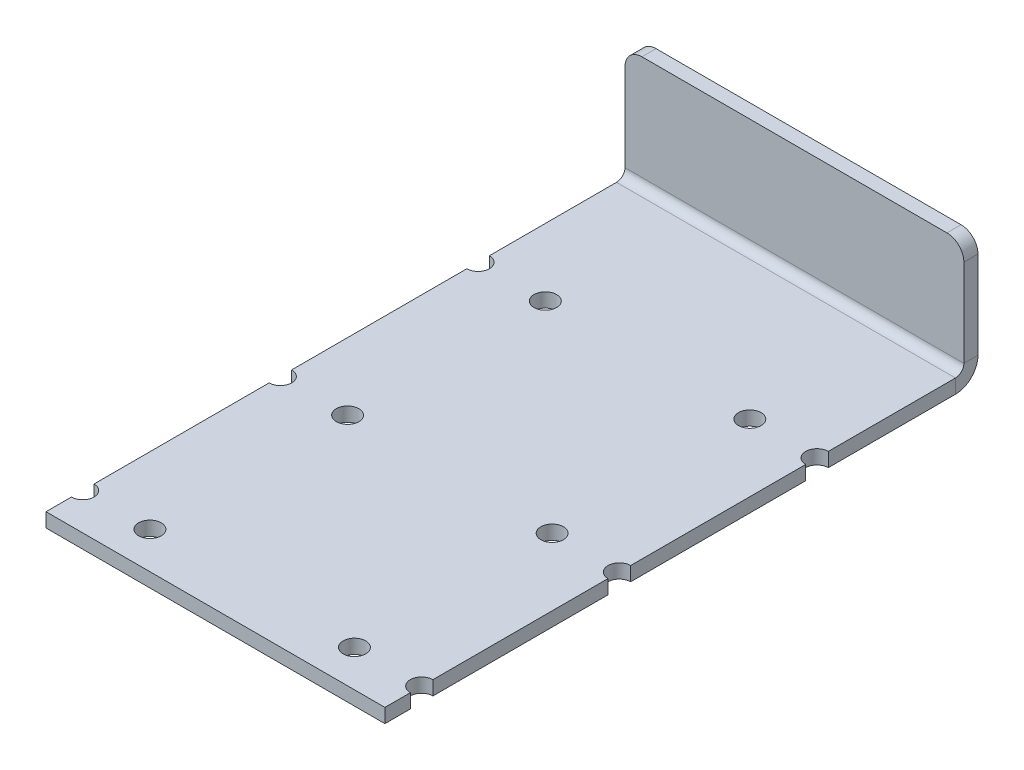
ISO-10303-21;
HEADER;
FILE_DESCRIPTION(('STEP AP214'),'2;1');
FILE_NAME('part.step','',(''),(''),'','','');
FILE_SCHEMA(('AUTOMOTIVE_DESIGN { 1 0 10303 214 1 1 1 1 }'));
ENDSEC;
DATA;
#1=APPLICATION_CONTEXT('core data for automotive mechanical design processes');
#2=APPLICATION_PROTOCOL_DEFINITION('international standard','automotive_design',2000,#1);
#3=PRODUCT_CONTEXT('',#1,'mechanical');
#4=PRODUCT('Part','Part','',(#3));
#5=PRODUCT_RELATED_PRODUCT_CATEGORY('part','',(#4));
#6=PRODUCT_DEFINITION_FORMATION('','',#4);
#7=PRODUCT_DEFINITION_CONTEXT('part definition',#1,'design');
#8=PRODUCT_DEFINITION('design','',#6,#7);
#9=PRODUCT_DEFINITION_SHAPE('','',#8);
#10=(LENGTH_UNIT() NAMED_UNIT(*) SI_UNIT(.MILLI.,.METRE.));
#11=(NAMED_UNIT(*) PLANE_ANGLE_UNIT() SI_UNIT($,.RADIAN.));
#12=(NAMED_UNIT(*) SI_UNIT($,.STERADIAN.) SOLID_ANGLE_UNIT());
#13=UNCERTAINTY_MEASURE_WITH_UNIT(LENGTH_MEASURE(1.E-05),#10,'distance_accuracy_value','');
#14=(GEOMETRIC_REPRESENTATION_CONTEXT(3) GLOBAL_UNCERTAINTY_ASSIGNED_CONTEXT((#13)) GLOBAL_UNIT_ASSIGNED_CONTEXT((#10,
#11,#12)) REPRESENTATION_CONTEXT('',''));
#15=CARTESIAN_POINT('',(0.,0.,0.));
#16=DIRECTION('',(0.,0.,1.));
#17=DIRECTION('',(1.,0.,0.));
#18=AXIS2_PLACEMENT_3D('',#15,#16,#17);
#19=CARTESIAN_POINT('',(-60.,61.5,4.99999999999998));
#20=DIRECTION('',(1.,0.,0.));
#21=DIRECTION('',(0.,0.,-1.));
#22=AXIS2_PLACEMENT_3D('',#19,#20,#21);
#23=PLANE('',#22);
#24=DIRECTION('',(0.,0.,-1.));
#25=VECTOR('',#24,1.);
#26=CARTESIAN_POINT('',(-60.,61.5,4.99999999999998));
#27=LINE('',#26,#25);
#28=CARTESIAN_POINT('',(-60.,61.4999999999998,53.0000000000014));
#29=VERTEX_POINT('',#28);
#30=CARTESIAN_POINT('',(-60.,61.5,7.99999999999997));
#31=VERTEX_POINT('',#30);
#32=EDGE_CURVE('E235',#29,#31,#27,.T.);
#33=ORIENTED_EDGE('',*,*,#32,.F.);
#34=DIRECTION('',(0.,1.,0.));
#35=VECTOR('',#34,1.);
#36=CARTESIAN_POINT('',(-60.,56.4999999999998,53.0000000000014));
#37=LINE('',#36,#35);
#38=CARTESIAN_POINT('',(-60.,66.4999999999998,53.0000000000014));
#39=VERTEX_POINT('',#38);
#40=EDGE_CURVE('E358',#29,#39,#37,.T.);
#41=ORIENTED_EDGE('',*,*,#40,.T.);
#42=DIRECTION('',(0.,0.,-1.));
#43=VECTOR('',#42,1.);
#44=CARTESIAN_POINT('',(-60.,66.5,5.));
#45=LINE('',#44,#43);
#46=CARTESIAN_POINT('',(-60.,66.5,7.99999999999999));
#47=VERTEX_POINT('',#46);
#48=EDGE_CURVE('E223',#39,#47,#45,.T.);
#49=ORIENTED_EDGE('',*,*,#48,.T.);
#50=DIRECTION('',(0.,-1.,0.));
#51=VECTOR('',#50,1.);
#52=CARTESIAN_POINT('',(-60.,66.5,7.99999999999999));
#53=LINE('',#52,#51);
#54=EDGE_CURVE('E394',#47,#31,#53,.T.);
#55=ORIENTED_EDGE('',*,*,#54,.T.);
#56=EDGE_LOOP('',(#33,#41,#49,#55));
#57=FACE_BOUND('',#56,.T.);
#58=ADVANCED_FACE('F45',(#57),#23,.F.);
#59=CARTESIAN_POINT('',(-60.,66.4999999999996,123.000000000001));
#60=VERTEX_POINT('',#59);
#61=CARTESIAN_POINT('',(-60.,66.4999999999998,61.0000000000014));
#62=VERTEX_POINT('',#61);
#63=EDGE_CURVE('E220',#60,#62,#45,.T.);
#64=ORIENTED_EDGE('',*,*,#63,.T.);
#65=DIRECTION('',(0.,1.,0.));
#66=VECTOR('',#65,1.);
#67=CARTESIAN_POINT('',(-60.,56.4999999999998,61.0000000000014));
#68=LINE('',#67,#66);
#69=CARTESIAN_POINT('',(-60.,61.4999999999998,61.0000000000014));
#70=VERTEX_POINT('',#69);
#71=EDGE_CURVE('E60',#62,#70,#68,.F.);
#72=ORIENTED_EDGE('',*,*,#71,.T.);
#73=CARTESIAN_POINT('',(-60.,61.4999999999996,123.000000000001));
#74=VERTEX_POINT('',#73);
#75=EDGE_CURVE('E342',#74,#70,#27,.T.);
#76=ORIENTED_EDGE('',*,*,#75,.F.);
#77=DIRECTION('',(0.,1.,0.));
#78=VECTOR('',#77,1.);
#79=CARTESIAN_POINT('',(-60.,56.4999999999996,123.000000000001));
#80=LINE('',#79,#78);
#81=EDGE_CURVE('E357',#74,#60,#80,.T.);
#82=ORIENTED_EDGE('',*,*,#81,.T.);
#83=EDGE_LOOP('',(#64,#72,#76,#82));
#84=FACE_BOUND('',#83,.T.);
#85=ADVANCED_FACE('F356',(#84),#23,.F.);
#86=CARTESIAN_POINT('',(-60.,66.4999999999993,193.000000000001));
#87=VERTEX_POINT('',#86);
#88=CARTESIAN_POINT('',(-60.,66.4999999999996,131.000000000001));
#89=VERTEX_POINT('',#88);
#90=EDGE_CURVE('E210',#87,#89,#45,.T.);
#91=ORIENTED_EDGE('',*,*,#90,.T.);
#92=DIRECTION('',(0.,1.,0.));
#93=VECTOR('',#92,1.);
#94=CARTESIAN_POINT('',(-60.,56.4999999999996,131.000000000001));
#95=LINE('',#94,#93);
#96=CARTESIAN_POINT('',(-60.,61.4999999999996,131.000000000001));
#97=VERTEX_POINT('',#96);
#98=EDGE_CURVE('E68',#89,#97,#95,.F.);
#99=ORIENTED_EDGE('',*,*,#98,.T.);
#100=CARTESIAN_POINT('',(-60.,61.4999999999993,193.000000000001));
#101=VERTEX_POINT('',#100);
#102=EDGE_CURVE('E212',#101,#97,#27,.T.);
#103=ORIENTED_EDGE('',*,*,#102,.F.);
#104=DIRECTION('',(0.,1.,0.));
#105=VECTOR('',#104,1.);
#106=CARTESIAN_POINT('',(-60.,56.4999999999993,193.000000000001));
#107=LINE('',#106,#105);
#108=EDGE_CURVE('E195',#101,#87,#107,.T.);
#109=ORIENTED_EDGE('',*,*,#108,.T.);
#110=EDGE_LOOP('',(#91,#99,#103,#109));
#111=FACE_BOUND('',#110,.T.);
#112=ADVANCED_FACE('F209',(#111),#23,.F.);
#113=CARTESIAN_POINT('',(60.,61.4999999999993,210.));
#114=DIRECTION('',(-1.,0.,0.));
#115=DIRECTION('',(0.,0.,1.));
#116=AXIS2_PLACEMENT_3D('',#113,#114,#115);
#117=PLANE('',#116);
#118=DIRECTION('',(0.,0.,1.));
#119=VECTOR('',#118,1.);
#120=CARTESIAN_POINT('',(60.,61.4999999999993,210.));
#121=LINE('',#120,#119);
#122=CARTESIAN_POINT('',(60.,61.4999999999998,61.));
#123=VERTEX_POINT('',#122);
#124=CARTESIAN_POINT('',(60.,61.4999999999996,123.));
#125=VERTEX_POINT('',#124);
#126=EDGE_CURVE('E424',#123,#125,#121,.T.);
#127=ORIENTED_EDGE('',*,*,#126,.F.);
#128=DIRECTION('',(0.,1.,0.));
#129=VECTOR('',#128,1.);
#130=CARTESIAN_POINT('',(60.,56.4999999999998,61.));
#131=LINE('',#130,#129);
#132=CARTESIAN_POINT('',(60.,66.4999999999998,61.));
#133=VERTEX_POINT('',#132);
#134=EDGE_CURVE('E391',#123,#133,#131,.T.);
#135=ORIENTED_EDGE('',*,*,#134,.T.);
#136=DIRECTION('',(0.,0.,1.));
#137=VECTOR('',#136,1.);
#138=CARTESIAN_POINT('',(60.,66.4999999999993,210.));
#139=LINE('',#138,#137);
#140=CARTESIAN_POINT('',(60.,66.4999999999996,123.));
#141=VERTEX_POINT('',#140);
#142=EDGE_CURVE('E233',#133,#141,#139,.T.);
#143=ORIENTED_EDGE('',*,*,#142,.T.);
#144=DIRECTION('',(0.,1.,0.));
#145=VECTOR('',#144,1.);
#146=CARTESIAN_POINT('',(60.,56.4999999999996,123.));
#147=LINE('',#146,#145);
#148=EDGE_CURVE('E306',#141,#125,#147,.F.);
#149=ORIENTED_EDGE('',*,*,#148,.T.);
#150=EDGE_LOOP('',(#127,#135,#143,#149));
#151=FACE_BOUND('',#150,.T.);
#152=ADVANCED_FACE('F426',(#151),#117,.F.);
#153=CARTESIAN_POINT('',(60.,61.4999999999996,131.));
#154=VERTEX_POINT('',#153);
#155=CARTESIAN_POINT('',(60.,61.4999999999993,193.));
#156=VERTEX_POINT('',#155);
#157=EDGE_CURVE('E317',#154,#156,#121,.T.);
#158=ORIENTED_EDGE('',*,*,#157,.F.);
#159=DIRECTION('',(0.,1.,0.));
#160=VECTOR('',#159,1.);
#161=CARTESIAN_POINT('',(60.,56.4999999999996,131.));
#162=LINE('',#161,#160);
#163=CARTESIAN_POINT('',(60.,66.4999999999996,131.));
#164=VERTEX_POINT('',#163);
#165=EDGE_CURVE('E303',#154,#164,#162,.T.);
#166=ORIENTED_EDGE('',*,*,#165,.T.);
#167=CARTESIAN_POINT('',(60.,66.4999999999993,193.));
#168=VERTEX_POINT('',#167);
#169=EDGE_CURVE('E315',#164,#168,#139,.T.);
#170=ORIENTED_EDGE('',*,*,#169,.T.);
#171=DIRECTION('',(0.,1.,0.));
#172=VECTOR('',#171,1.);
#173=CARTESIAN_POINT('',(60.,56.4999999999993,193.));
#174=LINE('',#173,#172);
#175=EDGE_CURVE('E380',#168,#156,#174,.F.);
#176=ORIENTED_EDGE('',*,*,#175,.T.);
#177=EDGE_LOOP('',(#158,#166,#170,#176));
#178=FACE_BOUND('',#177,.T.);
#179=ADVANCED_FACE('F313',(#178),#117,.F.);
#180=CARTESIAN_POINT('',(60.,61.4999999999993,201.));
#181=VERTEX_POINT('',#180);
#182=CARTESIAN_POINT('',(60.,61.4999999999993,210.));
#183=VERTEX_POINT('',#182);
#184=EDGE_CURVE('E339',#181,#183,#121,.T.);
#185=ORIENTED_EDGE('',*,*,#184,.F.);
#186=DIRECTION('',(0.,1.,0.));
#187=VECTOR('',#186,1.);
#188=CARTESIAN_POINT('',(60.,56.4999999999993,201.));
#189=LINE('',#188,#187);
#190=CARTESIAN_POINT('',(60.,66.4999999999993,201.));
#191=VERTEX_POINT('',#190);
#192=EDGE_CURVE('E328',#181,#191,#189,.T.);
#193=ORIENTED_EDGE('',*,*,#192,.T.);
#194=CARTESIAN_POINT('',(60.,66.4999999999993,210.));
#195=VERTEX_POINT('',#194);
#196=EDGE_CURVE('E222',#191,#195,#139,.T.);
#197=ORIENTED_EDGE('',*,*,#196,.T.);
#198=DIRECTION('',(0.,1.,0.));
#199=VECTOR('',#198,1.);
#200=CARTESIAN_POINT('',(60.,61.4999999999993,210.));
#201=LINE('',#200,#199);
#202=EDGE_CURVE('E239',#183,#195,#201,.T.);
#203=ORIENTED_EDGE('',*,*,#202,.F.);
#204=EDGE_LOOP('',(#185,#193,#197,#203));
#205=FACE_BOUND('',#204,.T.);
#206=ADVANCED_FACE('F326',(#205),#117,.F.);
#207=CARTESIAN_POINT('',(60.,66.5,5.));
#208=DIRECTION('',(-1.,0.,0.));
#209=DIRECTION('',(0.,0.,1.));
#210=AXIS2_PLACEMENT_3D('',#207,#208,#209);
#211=PLANE('',#210);
#212=DIRECTION('',(0.,0.,-1.));
#213=VECTOR('',#212,1.);
#214=CARTESIAN_POINT('',(60.,69.5,4.99999999999999));
#215=LINE('',#214,#213);
#216=CARTESIAN_POINT('',(60.,69.5,5.));
#217=VERTEX_POINT('',#216);
#218=CARTESIAN_POINT('',(60.,69.5,0.));
#219=VERTEX_POINT('',#218);
#220=EDGE_CURVE('E249',#217,#219,#215,.T.);
#221=ORIENTED_EDGE('',*,*,#220,.T.);
#222=DIRECTION('',(0.,1.,0.));
#223=VECTOR('',#222,1.);
#224=CARTESIAN_POINT('',(60.,66.5,0.));
#225=LINE('',#224,#223);
#226=CARTESIAN_POINT('',(60.,100.5,0.));
#227=VERTEX_POINT('',#226);
#228=EDGE_CURVE('E263',#219,#227,#225,.T.);
#229=ORIENTED_EDGE('',*,*,#228,.T.);
#230=DIRECTION('',(0.,0.,-1.));
#231=VECTOR('',#230,1.);
#232=CARTESIAN_POINT('',(60.,100.5,5.));
#233=LINE('',#232,#231);
#234=CARTESIAN_POINT('',(60.,100.5,5.));
#235=VERTEX_POINT('',#234);
#236=EDGE_CURVE('E295',#235,#227,#233,.T.);
#237=ORIENTED_EDGE('',*,*,#236,.F.);
#238=DIRECTION('',(0.,1.,0.));
#239=VECTOR('',#238,1.);
#240=CARTESIAN_POINT('',(60.,66.5,5.));
#241=LINE('',#240,#239);
#242=EDGE_CURVE('E265',#217,#235,#241,.T.);
#243=ORIENTED_EDGE('',*,*,#242,.F.);
#244=EDGE_LOOP('',(#221,#229,#237,#243));
#245=FACE_BOUND('',#244,.T.);
#246=ADVANCED_FACE('F47',(#245),#211,.F.);
#247=CARTESIAN_POINT('',(-60.,66.5,5.));
#248=DIRECTION('',(1.,0.,0.));
#249=DIRECTION('',(0.,0.,-1.));
#250=AXIS2_PLACEMENT_3D('',#247,#248,#249);
#251=PLANE('',#250);
#252=DIRECTION('',(0.,0.,-1.));
#253=VECTOR('',#252,1.);
#254=CARTESIAN_POINT('',(-60.,69.5,4.99999999999999));
#255=LINE('',#254,#253);
#256=CARTESIAN_POINT('',(-60.,69.5,5.));
#257=VERTEX_POINT('',#256);
#258=CARTESIAN_POINT('',(-60.,69.5,0.));
#259=VERTEX_POINT('',#258);
#260=EDGE_CURVE('E260',#257,#259,#255,.T.);
#261=ORIENTED_EDGE('',*,*,#260,.F.);
#262=DIRECTION('',(0.,-1.,0.));
#263=VECTOR('',#262,1.);
#264=CARTESIAN_POINT('',(-60.,66.5,5.));
#265=LINE('',#264,#263);
#266=CARTESIAN_POINT('',(-60.,100.5,5.));
#267=VERTEX_POINT('',#266);
#268=EDGE_CURVE('E274',#267,#257,#265,.T.);
#269=ORIENTED_EDGE('',*,*,#268,.F.);
#270=DIRECTION('',(0.,0.,-1.));
#271=VECTOR('',#270,1.);
#272=CARTESIAN_POINT('',(-60.,100.5,5.));
#273=LINE('',#272,#271);
#274=CARTESIAN_POINT('',(-60.,100.5,0.));
#275=VERTEX_POINT('',#274);
#276=EDGE_CURVE('E277',#267,#275,#273,.T.);
#277=ORIENTED_EDGE('',*,*,#276,.T.);
#278=DIRECTION('',(0.,-1.,0.));
#279=VECTOR('',#278,1.);
#280=CARTESIAN_POINT('',(-60.,66.5,0.));
#281=LINE('',#280,#279);
#282=EDGE_CURVE('E268',#275,#259,#281,.T.);
#283=ORIENTED_EDGE('',*,*,#282,.T.);
#284=EDGE_LOOP('',(#261,#269,#277,#283));
#285=FACE_BOUND('',#284,.T.);
#286=ADVANCED_FACE('F766',(#285),#251,.F.);
#287=CARTESIAN_POINT('',(54.,100.5,5.));
#288=DIRECTION('',(0.,0.,1.));
#289=DIRECTION('',(1.,0.,0.));
#290=AXIS2_PLACEMENT_3D('',#287,#288,#289);
#291=PLANE('',#290);
#292=ORIENTED_EDGE('',*,*,#268,.T.);
#293=DIRECTION('',(1.,0.,0.));
#294=VECTOR('',#293,1.);
#295=CARTESIAN_POINT('',(60.,69.5,4.99999999999999));
#296=LINE('',#295,#294);
#297=EDGE_CURVE('E255',#217,#257,#296,.F.);
#298=ORIENTED_EDGE('',*,*,#297,.F.);
#299=ORIENTED_EDGE('',*,*,#242,.T.);
#300=CARTESIAN_POINT('',(54.,100.5,5.));
#301=DIRECTION('',(0.,0.,1.));
#302=DIRECTION('',(1.,0.,0.));
#303=AXIS2_PLACEMENT_3D('',#300,#301,#302);
#304=CIRCLE('',#303,6.);
#305=CARTESIAN_POINT('',(54.,106.5,5.));
#306=VERTEX_POINT('',#305);
#307=EDGE_CURVE('E267',#235,#306,#304,.T.);
#308=ORIENTED_EDGE('',*,*,#307,.T.);
#309=DIRECTION('',(-1.,0.,0.));
#310=VECTOR('',#309,1.);
#311=CARTESIAN_POINT('',(-54.,106.5,5.));
#312=LINE('',#311,#310);
#313=CARTESIAN_POINT('',(-54.,106.5,5.));
#314=VERTEX_POINT('',#313);
#315=EDGE_CURVE('E270',#306,#314,#312,.T.);
#316=ORIENTED_EDGE('',*,*,#315,.T.);
#317=CARTESIAN_POINT('',(-54.,100.5,5.));
#318=DIRECTION('',(0.,0.,1.));
#319=DIRECTION('',(1.,0.,0.));
#320=AXIS2_PLACEMENT_3D('',#317,#318,#319);
#321=CIRCLE('',#320,6.);
#322=EDGE_CURVE('E272',#314,#267,#321,.T.);
#323=ORIENTED_EDGE('',*,*,#322,.T.);
#324=EDGE_LOOP('',(#292,#298,#299,#308,#316,#323));
#325=FACE_BOUND('',#324,.T.);
#326=ADVANCED_FACE('F777',(#325),#291,.T.);
#327=CARTESIAN_POINT('',(54.,100.5,0.));
#328=DIRECTION('',(0.,0.,1.));
#329=DIRECTION('',(1.,0.,0.));
#330=AXIS2_PLACEMENT_3D('',#327,#328,#329);
#331=PLANE('',#330);
#332=DIRECTION('',(1.,0.,0.));
#333=VECTOR('',#332,1.);
#334=CARTESIAN_POINT('',(60.,69.5,0.));
#335=LINE('',#334,#333);
#336=EDGE_CURVE('E243',#219,#259,#335,.F.);
#337=ORIENTED_EDGE('',*,*,#336,.T.);
#338=ORIENTED_EDGE('',*,*,#282,.F.);
#339=CARTESIAN_POINT('',(-54.,100.5,0.));
#340=DIRECTION('',(0.,0.,1.));
#341=DIRECTION('',(1.,0.,0.));
#342=AXIS2_PLACEMENT_3D('',#339,#340,#341);
#343=CIRCLE('',#342,6.);
#344=CARTESIAN_POINT('',(-54.,106.5,0.));
#345=VERTEX_POINT('',#344);
#346=EDGE_CURVE('E283',#345,#275,#343,.T.);
#347=ORIENTED_EDGE('',*,*,#346,.F.);
#348=DIRECTION('',(-1.,0.,0.));
#349=VECTOR('',#348,1.);
#350=CARTESIAN_POINT('',(-54.,106.5,0.));
#351=LINE('',#350,#349);
#352=CARTESIAN_POINT('',(54.,106.5,0.));
#353=VERTEX_POINT('',#352);
#354=EDGE_CURVE('E281',#353,#345,#351,.T.);
#355=ORIENTED_EDGE('',*,*,#354,.F.);
#356=CARTESIAN_POINT('',(54.,100.5,0.));
#357=DIRECTION('',(0.,0.,1.));
#358=DIRECTION('',(1.,0.,0.));
#359=AXIS2_PLACEMENT_3D('',#356,#357,#358);
#360=CIRCLE('',#359,6.);
#361=EDGE_CURVE('E279',#227,#353,#360,.T.);
#362=ORIENTED_EDGE('',*,*,#361,.F.);
#363=ORIENTED_EDGE('',*,*,#228,.F.);
#364=EDGE_LOOP('',(#337,#338,#347,#355,#362,#363));
#365=FACE_BOUND('',#364,.T.);
#366=ADVANCED_FACE('F789',(#365),#331,.F.);
#367=CARTESIAN_POINT('',(54.,100.5,5.));
#368=DIRECTION('',(0.,0.,-1.));
#369=DIRECTION('',(-1.,0.,0.));
#370=AXIS2_PLACEMENT_3D('',#367,#368,#369);
#371=CYLINDRICAL_SURFACE('',#370,6.);
#372=ORIENTED_EDGE('',*,*,#361,.T.);
#373=DIRECTION('',(0.,0.,-1.));
#374=VECTOR('',#373,1.);
#375=CARTESIAN_POINT('',(54.,106.5,5.));
#376=LINE('',#375,#374);
#377=EDGE_CURVE('E292',#306,#353,#376,.T.);
#378=ORIENTED_EDGE('',*,*,#377,.F.);
#379=ORIENTED_EDGE('',*,*,#307,.F.);
#380=ORIENTED_EDGE('',*,*,#236,.T.);
#381=EDGE_LOOP('',(#372,#378,#379,#380));
#382=FACE_BOUND('',#381,.T.);
#383=ADVANCED_FACE('F801',(#382),#371,.T.);
#384=CARTESIAN_POINT('',(-54.,106.5,5.));
#385=DIRECTION('',(0.,-1.,0.));
#386=DIRECTION('',(0.,0.,-1.));
#387=AXIS2_PLACEMENT_3D('',#384,#385,#386);
#388=PLANE('',#387);
#389=ORIENTED_EDGE('',*,*,#354,.T.);
#390=DIRECTION('',(0.,0.,-1.));
#391=VECTOR('',#390,1.);
#392=CARTESIAN_POINT('',(-54.,106.5,5.));
#393=LINE('',#392,#391);
#394=EDGE_CURVE('E289',#314,#345,#393,.T.);
#395=ORIENTED_EDGE('',*,*,#394,.F.);
#396=ORIENTED_EDGE('',*,*,#315,.F.);
#397=ORIENTED_EDGE('',*,*,#377,.T.);
#398=EDGE_LOOP('',(#389,#395,#396,#397));
#399=FACE_BOUND('',#398,.T.);
#400=ADVANCED_FACE('F813',(#399),#388,.F.);
#401=CARTESIAN_POINT('',(-54.,100.5,5.));
#402=DIRECTION('',(0.,0.,-1.));
#403=DIRECTION('',(-1.,0.,0.));
#404=AXIS2_PLACEMENT_3D('',#401,#402,#403);
#405=CYLINDRICAL_SURFACE('',#404,6.);
#406=ORIENTED_EDGE('',*,*,#346,.T.);
#407=ORIENTED_EDGE('',*,*,#276,.F.);
#408=ORIENTED_EDGE('',*,*,#322,.F.);
#409=ORIENTED_EDGE('',*,*,#394,.T.);
#410=EDGE_LOOP('',(#406,#407,#408,#409));
#411=FACE_BOUND('',#410,.T.);
#412=ADVANCED_FACE('F755',(#411),#405,.T.);
#413=CARTESIAN_POINT('',(-60.,69.5,8.));
#414=DIRECTION('',(-1.,0.,0.));
#415=DIRECTION('',(0.,0.,1.));
#416=AXIS2_PLACEMENT_3D('',#413,#414,#415);
#417=PLANE('',#416);
#418=ORIENTED_EDGE('',*,*,#54,.F.);
#419=CARTESIAN_POINT('',(-60.,69.5,8.));
#420=DIRECTION('',(1.,0.,0.));
#421=DIRECTION('',(0.,0.,-1.));
#422=AXIS2_PLACEMENT_3D('',#419,#420,#421);
#423=CIRCLE('',#422,3.);
#424=EDGE_CURVE('E252',#257,#47,#423,.F.);
#425=ORIENTED_EDGE('',*,*,#424,.F.);
#426=ORIENTED_EDGE('',*,*,#260,.T.);
#427=CARTESIAN_POINT('',(-60.,69.5,8.));
#428=DIRECTION('',(1.,0.,0.));
#429=DIRECTION('',(0.,0.,-1.));
#430=AXIS2_PLACEMENT_3D('',#427,#428,#429);
#431=CIRCLE('',#430,8.);
#432=EDGE_CURVE('E245',#259,#31,#431,.F.);
#433=ORIENTED_EDGE('',*,*,#432,.T.);
#434=EDGE_LOOP('',(#418,#425,#426,#433));
#435=FACE_BOUND('',#434,.T.);
#436=ADVANCED_FACE('F410',(#435),#417,.T.);
#437=CARTESIAN_POINT('',(60.,69.5,8.));
#438=DIRECTION('',(-1.,0.,0.));
#439=DIRECTION('',(0.,0.,1.));
#440=AXIS2_PLACEMENT_3D('',#437,#438,#439);
#441=PLANE('',#440);
#442=CARTESIAN_POINT('',(60.,69.5,8.));
#443=DIRECTION('',(1.,0.,0.));
#444=DIRECTION('',(0.,0.,-1.));
#445=AXIS2_PLACEMENT_3D('',#442,#443,#444);
#446=CIRCLE('',#445,3.);
#447=CARTESIAN_POINT('',(60.,66.5,7.99999999999999));
#448=VERTEX_POINT('',#447);
#449=EDGE_CURVE('E242',#448,#217,#446,.T.);
#450=ORIENTED_EDGE('',*,*,#449,.F.);
#451=DIRECTION('',(0.,-1.,0.));
#452=VECTOR('',#451,1.);
#453=CARTESIAN_POINT('',(60.,66.5,7.99999999999999));
#454=LINE('',#453,#452);
#455=CARTESIAN_POINT('',(60.,61.5,7.99999999999997));
#456=VERTEX_POINT('',#455);
#457=EDGE_CURVE('E397',#448,#456,#454,.T.);
#458=ORIENTED_EDGE('',*,*,#457,.T.);
#459=CARTESIAN_POINT('',(60.,69.5,8.));
#460=DIRECTION('',(1.,0.,0.));
#461=DIRECTION('',(0.,0.,-1.));
#462=AXIS2_PLACEMENT_3D('',#459,#460,#461);
#463=CIRCLE('',#462,8.);
#464=EDGE_CURVE('E246',#456,#219,#463,.T.);
#465=ORIENTED_EDGE('',*,*,#464,.T.);
#466=ORIENTED_EDGE('',*,*,#220,.F.);
#467=EDGE_LOOP('',(#450,#458,#465,#466));
#468=FACE_BOUND('',#467,.T.);
#469=ADVANCED_FACE('F420',(#468),#441,.F.);
#470=CARTESIAN_POINT('',(60.,69.5,8.));
#471=DIRECTION('',(1.,0.,0.));
#472=DIRECTION('',(0.,-1.,0.));
#473=AXIS2_PLACEMENT_3D('',#470,#471,#472);
#474=CYLINDRICAL_SURFACE('',#473,8.);
#475=ORIENTED_EDGE('',*,*,#336,.F.);
#476=ORIENTED_EDGE('',*,*,#464,.F.);
#477=DIRECTION('',(-1.,0.,0.));
#478=VECTOR('',#477,1.);
#479=CARTESIAN_POINT('',(0.,61.5,7.99999999999997));
#480=LINE('',#479,#478);
#481=EDGE_CURVE('E400',#456,#31,#480,.T.);
#482=ORIENTED_EDGE('',*,*,#481,.T.);
#483=ORIENTED_EDGE('',*,*,#432,.F.);
#484=EDGE_LOOP('',(#475,#476,#482,#483));
#485=FACE_BOUND('',#484,.T.);
#486=ADVANCED_FACE('F449',(#485),#474,.T.);
#487=CARTESIAN_POINT('',(60.,69.5,8.));
#488=DIRECTION('',(1.,0.,0.));
#489=DIRECTION('',(0.,-1.,0.));
#490=AXIS2_PLACEMENT_3D('',#487,#488,#489);
#491=CYLINDRICAL_SURFACE('',#490,3.);
#492=ORIENTED_EDGE('',*,*,#297,.T.);
#493=ORIENTED_EDGE('',*,*,#424,.T.);
#494=DIRECTION('',(1.,0.,0.));
#495=VECTOR('',#494,1.);
#496=CARTESIAN_POINT('',(-60.,66.5,7.99999999999999));
#497=LINE('',#496,#495);
#498=EDGE_CURVE('E395',#47,#448,#497,.T.);
#499=ORIENTED_EDGE('',*,*,#498,.T.);
#500=ORIENTED_EDGE('',*,*,#449,.T.);
#501=EDGE_LOOP('',(#492,#493,#499,#500));
#502=FACE_BOUND('',#501,.T.);
#503=ADVANCED_FACE('F412',(#502),#491,.F.);
#504=CARTESIAN_POINT('',(-60.,66.4999999999993,210.));
#505=VERTEX_POINT('',#504);
#506=CARTESIAN_POINT('',(-60.,66.4999999999993,201.000000000001));
#507=VERTEX_POINT('',#506);
#508=EDGE_CURVE('E219',#505,#507,#45,.T.);
#509=ORIENTED_EDGE('',*,*,#508,.T.);
#510=DIRECTION('',(0.,1.,0.));
#511=VECTOR('',#510,1.);
#512=CARTESIAN_POINT('',(-60.,56.4999999999993,201.000000000001));
#513=LINE('',#512,#511);
#514=CARTESIAN_POINT('',(-60.,61.4999999999993,201.000000000001));
#515=VERTEX_POINT('',#514);
#516=EDGE_CURVE('E198',#507,#515,#513,.F.);
#517=ORIENTED_EDGE('',*,*,#516,.T.);
#518=CARTESIAN_POINT('',(-60.,61.4999999999993,210.));
#519=VERTEX_POINT('',#518);
#520=EDGE_CURVE('E337',#519,#515,#27,.T.);
#521=ORIENTED_EDGE('',*,*,#520,.F.);
#522=DIRECTION('',(0.,1.,0.));
#523=VECTOR('',#522,1.);
#524=CARTESIAN_POINT('',(-60.,61.4999999999993,210.));
#525=LINE('',#524,#523);
#526=EDGE_CURVE('E236',#519,#505,#525,.T.);
#527=ORIENTED_EDGE('',*,*,#526,.T.);
#528=EDGE_LOOP('',(#509,#517,#521,#527));
#529=FACE_BOUND('',#528,.T.);
#530=ADVANCED_FACE('F334',(#529),#23,.F.);
#531=CARTESIAN_POINT('',(60.,66.4999999999998,53.));
#532=VERTEX_POINT('',#531);
#533=EDGE_CURVE('E229',#448,#532,#139,.T.);
#534=ORIENTED_EDGE('',*,*,#533,.T.);
#535=DIRECTION('',(0.,1.,0.));
#536=VECTOR('',#535,1.);
#537=CARTESIAN_POINT('',(60.,56.4999999999998,53.));
#538=LINE('',#537,#536);
#539=CARTESIAN_POINT('',(60.,61.4999999999998,53.));
#540=VERTEX_POINT('',#539);
#541=EDGE_CURVE('E388',#532,#540,#538,.F.);
#542=ORIENTED_EDGE('',*,*,#541,.T.);
#543=EDGE_CURVE('E341',#456,#540,#121,.T.);
#544=ORIENTED_EDGE('',*,*,#543,.F.);
#545=ORIENTED_EDGE('',*,*,#457,.F.);
#546=EDGE_LOOP('',(#534,#542,#544,#545));
#547=FACE_BOUND('',#546,.T.);
#548=ADVANCED_FACE('F417',(#547),#117,.F.);
#549=CARTESIAN_POINT('',(0.,61.5,2.16637179839552E-13));
#550=DIRECTION('',(0.,1.,0.));
#551=DIRECTION('',(0.,0.,1.));
#552=AXIS2_PLACEMENT_3D('',#549,#550,#551);
#553=PLANE('',#552);
#554=CARTESIAN_POINT('',(-36.2049999999994,61.4999999999993,197.000000000001));
#555=DIRECTION('',(0.,1.,0.));
#556=DIRECTION('',(0.,0.,1.));
#557=AXIS2_PLACEMENT_3D('',#554,#555,#556);
#558=CIRCLE('',#557,4.00000000000004);
#559=CARTESIAN_POINT('',(-36.2049999999994,61.4999999999993,201.000000000001));
#560=VERTEX_POINT('',#559);
#561=EDGE_CURVE('E374',#560,#560,#558,.T.);
#562=ORIENTED_EDGE('',*,*,#561,.T.);
#563=EDGE_LOOP('',(#562));
#564=FACE_BOUND('',#563,.T.);
#565=CARTESIAN_POINT('',(-36.2049999999998,61.4999999999996,127.000000000001));
#566=DIRECTION('',(0.,1.,0.));
#567=DIRECTION('',(0.,0.,1.));
#568=AXIS2_PLACEMENT_3D('',#565,#566,#567);
#569=CIRCLE('',#568,4.00000000000001);
#570=CARTESIAN_POINT('',(-36.2049999999998,61.4999999999996,131.000000000001));
#571=VERTEX_POINT('',#570);
#572=EDGE_CURVE('E371',#571,#571,#569,.T.);
#573=ORIENTED_EDGE('',*,*,#572,.T.);
#574=EDGE_LOOP('',(#573));
#575=FACE_BOUND('',#574,.T.);
#576=CARTESIAN_POINT('',(36.2050000000004,61.4999999999996,127.));
#577=DIRECTION('',(0.,1.,0.));
#578=DIRECTION('',(0.,0.,1.));
#579=AXIS2_PLACEMENT_3D('',#576,#577,#578);
#580=CIRCLE('',#579,4.00000000000001);
#581=CARTESIAN_POINT('',(36.2050000000004,61.4999999999996,131.));
#582=VERTEX_POINT('',#581);
#583=EDGE_CURVE('E368',#582,#582,#580,.T.);
#584=ORIENTED_EDGE('',*,*,#583,.T.);
#585=EDGE_LOOP('',(#584));
#586=FACE_BOUND('',#585,.T.);
#587=CARTESIAN_POINT('',(36.2049999999998,61.4999999999998,57.));
#588=DIRECTION('',(0.,1.,0.));
#589=DIRECTION('',(0.,0.,1.));
#590=AXIS2_PLACEMENT_3D('',#587,#588,#589);
#591=CIRCLE('',#590,4.00000000000001);
#592=CARTESIAN_POINT('',(36.2049999999998,61.4999999999998,61.));
#593=VERTEX_POINT('',#592);
#594=EDGE_CURVE('E361',#593,#593,#591,.T.);
#595=ORIENTED_EDGE('',*,*,#594,.T.);
#596=EDGE_LOOP('',(#595));
#597=FACE_BOUND('',#596,.T.);
#598=CARTESIAN_POINT('',(-36.2050000000002,61.4999999999998,57.0000000000014));
#599=DIRECTION('',(0.,1.,0.));
#600=DIRECTION('',(0.,0.,1.));
#601=AXIS2_PLACEMENT_3D('',#598,#599,#600);
#602=CIRCLE('',#601,4.00000000000001);
#603=CARTESIAN_POINT('',(-36.2050000000002,61.4999999999998,61.0000000000014));
#604=VERTEX_POINT('',#603);
#605=EDGE_CURVE('E482',#604,#604,#602,.T.);
#606=ORIENTED_EDGE('',*,*,#605,.T.);
#607=EDGE_LOOP('',(#606));
#608=FACE_BOUND('',#607,.T.);
#609=CARTESIAN_POINT('',(36.2050000000008,61.4999999999993,197.));
#610=DIRECTION('',(0.,1.,0.));
#611=DIRECTION('',(0.,0.,1.));
#612=AXIS2_PLACEMENT_3D('',#609,#610,#611);
#613=CIRCLE('',#612,3.99999999999999);
#614=CARTESIAN_POINT('',(36.2050000000008,61.4999999999993,201.));
#615=VERTEX_POINT('',#614);
#616=EDGE_CURVE('E480',#615,#615,#613,.T.);
#617=ORIENTED_EDGE('',*,*,#616,.T.);
#618=EDGE_LOOP('',(#617));
#619=FACE_BOUND('',#618,.T.);
#620=ORIENTED_EDGE('',*,*,#543,.T.);
#621=CARTESIAN_POINT('',(60.,61.4999999999998,57.));
#622=DIRECTION('',(0.,1.,0.));
#623=DIRECTION('',(0.,0.,1.));
#624=AXIS2_PLACEMENT_3D('',#621,#622,#623);
#625=CIRCLE('',#624,4.00000000000001);
#626=EDGE_CURVE('E318',#540,#123,#625,.T.);
#627=ORIENTED_EDGE('',*,*,#626,.T.);
#628=ORIENTED_EDGE('',*,*,#126,.T.);
#629=CARTESIAN_POINT('',(60.0000000000004,61.4999999999996,127.));
#630=DIRECTION('',(0.,1.,0.));
#631=DIRECTION('',(0.,0.,1.));
#632=AXIS2_PLACEMENT_3D('',#629,#630,#631);
#633=CIRCLE('',#632,4.00000000000001);
#634=EDGE_CURVE('E383',#125,#154,#633,.T.);
#635=ORIENTED_EDGE('',*,*,#634,.T.);
#636=ORIENTED_EDGE('',*,*,#157,.T.);
#637=CARTESIAN_POINT('',(60.0000000000008,61.4999999999993,197.));
#638=DIRECTION('',(0.,1.,0.));
#639=DIRECTION('',(0.,0.,1.));
#640=AXIS2_PLACEMENT_3D('',#637,#638,#639);
#641=CIRCLE('',#640,4.00000000000003);
#642=EDGE_CURVE('E377',#156,#181,#641,.T.);
#643=ORIENTED_EDGE('',*,*,#642,.T.);
#644=ORIENTED_EDGE('',*,*,#184,.T.);
#645=DIRECTION('',(-1.,0.,0.));
#646=VECTOR('',#645,1.);
#647=CARTESIAN_POINT('',(-60.,61.4999999999993,210.));
#648=LINE('',#647,#646);
#649=EDGE_CURVE('E227',#183,#519,#648,.T.);
#650=ORIENTED_EDGE('',*,*,#649,.T.);
#651=ORIENTED_EDGE('',*,*,#520,.T.);
#652=CARTESIAN_POINT('',(-59.9999999999992,61.4999999999993,197.000000000001));
#653=DIRECTION('',(0.,1.,0.));
#654=DIRECTION('',(0.,0.,1.));
#655=AXIS2_PLACEMENT_3D('',#652,#653,#654);
#656=CIRCLE('',#655,4.00000000000003);
#657=EDGE_CURVE('E485',#515,#101,#656,.T.);
#658=ORIENTED_EDGE('',*,*,#657,.T.);
#659=ORIENTED_EDGE('',*,*,#102,.T.);
#660=CARTESIAN_POINT('',(-59.9999999999996,61.4999999999996,127.000000000001));
#661=DIRECTION('',(0.,1.,0.));
#662=DIRECTION('',(0.,0.,1.));
#663=AXIS2_PLACEMENT_3D('',#660,#661,#662);
#664=CIRCLE('',#663,4.00000000000001);
#665=EDGE_CURVE('E213',#97,#74,#664,.T.);
#666=ORIENTED_EDGE('',*,*,#665,.T.);
#667=ORIENTED_EDGE('',*,*,#75,.T.);
#668=CARTESIAN_POINT('',(-60.,61.4999999999998,57.0000000000014));
#669=DIRECTION('',(0.,1.,0.));
#670=DIRECTION('',(0.,0.,1.));
#671=AXIS2_PLACEMENT_3D('',#668,#669,#670);
#672=CIRCLE('',#671,4.00000000000001);
#673=EDGE_CURVE('E353',#70,#29,#672,.T.);
#674=ORIENTED_EDGE('',*,*,#673,.T.);
#675=ORIENTED_EDGE('',*,*,#32,.T.);
#676=ORIENTED_EDGE('',*,*,#481,.F.);
#677=EDGE_LOOP('',(#620,#627,#628,#635,#636,#643,#644,#650,#651,#658,#659,#666,#667,#674,#675,#676));
#678=FACE_BOUND('',#677,.T.);
#679=ADVANCED_FACE('F352',(#564,#575,#586,#597,#608,#619,#678),#553,.F.);
#680=CARTESIAN_POINT('',(0.,66.5,2.34094586533768E-13));
#681=DIRECTION('',(0.,1.,0.));
#682=DIRECTION('',(0.,0.,1.));
#683=AXIS2_PLACEMENT_3D('',#680,#681,#682);
#684=PLANE('',#683);
#685=CARTESIAN_POINT('',(60.,66.4999999999998,57.));
#686=DIRECTION('',(0.,1.,0.));
#687=DIRECTION('',(0.,0.,1.));
#688=AXIS2_PLACEMENT_3D('',#685,#686,#687);
#689=CIRCLE('',#688,4.00000000000001);
#690=EDGE_CURVE('E11',#532,#133,#689,.T.);
#691=ORIENTED_EDGE('',*,*,#690,.F.);
#692=ORIENTED_EDGE('',*,*,#533,.F.);
#693=ORIENTED_EDGE('',*,*,#498,.F.);
#694=ORIENTED_EDGE('',*,*,#48,.F.);
#695=CARTESIAN_POINT('',(-60.,66.4999999999998,57.0000000000014));
#696=DIRECTION('',(0.,1.,0.));
#697=DIRECTION('',(0.,0.,1.));
#698=AXIS2_PLACEMENT_3D('',#695,#696,#697);
#699=CIRCLE('',#698,4.00000000000001);
#700=EDGE_CURVE('E507',#62,#39,#699,.T.);
#701=ORIENTED_EDGE('',*,*,#700,.F.);
#702=ORIENTED_EDGE('',*,*,#63,.F.);
#703=CARTESIAN_POINT('',(-59.9999999999996,66.4999999999996,127.000000000001));
#704=DIRECTION('',(0.,1.,0.));
#705=DIRECTION('',(0.,0.,1.));
#706=AXIS2_PLACEMENT_3D('',#703,#704,#705);
#707=CIRCLE('',#706,4.00000000000001);
#708=EDGE_CURVE('E204',#89,#60,#707,.T.);
#709=ORIENTED_EDGE('',*,*,#708,.F.);
#710=ORIENTED_EDGE('',*,*,#90,.F.);
#711=CARTESIAN_POINT('',(-59.9999999999992,66.4999999999993,197.000000000001));
#712=DIRECTION('',(0.,1.,0.));
#713=DIRECTION('',(0.,0.,1.));
#714=AXIS2_PLACEMENT_3D('',#711,#712,#713);
#715=CIRCLE('',#714,4.00000000000003);
#716=EDGE_CURVE('E192',#507,#87,#715,.T.);
#717=ORIENTED_EDGE('',*,*,#716,.F.);
#718=ORIENTED_EDGE('',*,*,#508,.F.);
#719=DIRECTION('',(-1.,0.,0.));
#720=VECTOR('',#719,1.);
#721=CARTESIAN_POINT('',(-60.,66.4999999999993,210.));
#722=LINE('',#721,#720);
#723=EDGE_CURVE('E232',#195,#505,#722,.T.);
#724=ORIENTED_EDGE('',*,*,#723,.F.);
#725=ORIENTED_EDGE('',*,*,#196,.F.);
#726=CARTESIAN_POINT('',(60.0000000000008,66.4999999999993,197.));
#727=DIRECTION('',(0.,1.,0.));
#728=DIRECTION('',(0.,0.,1.));
#729=AXIS2_PLACEMENT_3D('',#726,#727,#728);
#730=CIRCLE('',#729,4.00000000000003);
#731=EDGE_CURVE('E298',#168,#191,#730,.T.);
#732=ORIENTED_EDGE('',*,*,#731,.F.);
#733=ORIENTED_EDGE('',*,*,#169,.F.);
#734=CARTESIAN_POINT('',(60.0000000000004,66.4999999999996,127.));
#735=DIRECTION('',(0.,1.,0.));
#736=DIRECTION('',(0.,0.,1.));
#737=AXIS2_PLACEMENT_3D('',#734,#735,#736);
#738=CIRCLE('',#737,4.00000000000001);
#739=EDGE_CURVE('E53',#141,#164,#738,.T.);
#740=ORIENTED_EDGE('',*,*,#739,.F.);
#741=ORIENTED_EDGE('',*,*,#142,.F.);
#742=EDGE_LOOP('',(#691,#692,#693,#694,#701,#702,#709,#710,#717,#718,#724,#725,#732,#733,#740,#741));
#743=FACE_BOUND('',#742,.T.);
#744=CARTESIAN_POINT('',(-36.2049999999994,66.4999999999993,197.000000000001));
#745=DIRECTION('',(0.,1.,0.));
#746=DIRECTION('',(0.,0.,1.));
#747=AXIS2_PLACEMENT_3D('',#744,#745,#746);
#748=CIRCLE('',#747,4.00000000000004);
#749=CARTESIAN_POINT('',(-36.2049999999994,66.4999999999993,201.000000000001));
#750=VERTEX_POINT('',#749);
#751=EDGE_CURVE('E487',#750,#750,#748,.T.);
#752=ORIENTED_EDGE('',*,*,#751,.F.);
#753=EDGE_LOOP('',(#752));
#754=FACE_BOUND('',#753,.T.);
#755=CARTESIAN_POINT('',(-36.2049999999998,66.4999999999996,127.000000000001));
#756=DIRECTION('',(0.,1.,0.));
#757=DIRECTION('',(0.,0.,1.));
#758=AXIS2_PLACEMENT_3D('',#755,#756,#757);
#759=CIRCLE('',#758,4.00000000000001);
#760=CARTESIAN_POINT('',(-36.2049999999998,66.4999999999996,131.000000000001));
#761=VERTEX_POINT('',#760);
#762=EDGE_CURVE('E500',#761,#761,#759,.T.);
#763=ORIENTED_EDGE('',*,*,#762,.F.);
#764=EDGE_LOOP('',(#763));
#765=FACE_BOUND('',#764,.T.);
#766=CARTESIAN_POINT('',(36.2050000000004,66.4999999999996,127.));
#767=DIRECTION('',(0.,1.,0.));
#768=DIRECTION('',(0.,0.,1.));
#769=AXIS2_PLACEMENT_3D('',#766,#767,#768);
#770=CIRCLE('',#769,4.00000000000001);
#771=CARTESIAN_POINT('',(36.2050000000004,66.4999999999996,131.));
#772=VERTEX_POINT('',#771);
#773=EDGE_CURVE('E497',#772,#772,#770,.T.);
#774=ORIENTED_EDGE('',*,*,#773,.F.);
#775=EDGE_LOOP('',(#774));
#776=FACE_BOUND('',#775,.T.);
#777=CARTESIAN_POINT('',(36.2049999999998,66.4999999999998,57.));
#778=DIRECTION('',(0.,1.,0.));
#779=DIRECTION('',(0.,0.,1.));
#780=AXIS2_PLACEMENT_3D('',#777,#778,#779);
#781=CIRCLE('',#780,4.00000000000001);
#782=CARTESIAN_POINT('',(36.2049999999998,66.4999999999998,61.));
#783=VERTEX_POINT('',#782);
#784=EDGE_CURVE('E494',#783,#783,#781,.T.);
#785=ORIENTED_EDGE('',*,*,#784,.F.);
#786=EDGE_LOOP('',(#785));
#787=FACE_BOUND('',#786,.T.);
#788=CARTESIAN_POINT('',(-36.2050000000002,66.4999999999998,57.0000000000014));
#789=DIRECTION('',(0.,1.,0.));
#790=DIRECTION('',(0.,0.,1.));
#791=AXIS2_PLACEMENT_3D('',#788,#789,#790);
#792=CIRCLE('',#791,4.00000000000001);
#793=CARTESIAN_POINT('',(-36.2050000000002,66.4999999999998,61.0000000000014));
#794=VERTEX_POINT('',#793);
#795=EDGE_CURVE('E203',#794,#794,#792,.T.);
#796=ORIENTED_EDGE('',*,*,#795,.F.);
#797=EDGE_LOOP('',(#796));
#798=FACE_BOUND('',#797,.T.);
#799=CARTESIAN_POINT('',(36.2050000000008,66.4999999999993,197.));
#800=DIRECTION('',(0.,1.,0.));
#801=DIRECTION('',(0.,0.,1.));
#802=AXIS2_PLACEMENT_3D('',#799,#800,#801);
#803=CIRCLE('',#802,3.99999999999999);
#804=CARTESIAN_POINT('',(36.2050000000008,66.4999999999993,201.));
#805=VERTEX_POINT('',#804);
#806=EDGE_CURVE('E477',#805,#805,#803,.T.);
#807=ORIENTED_EDGE('',*,*,#806,.F.);
#808=EDGE_LOOP('',(#807));
#809=FACE_BOUND('',#808,.T.);
#810=ADVANCED_FACE('F216',(#743,#754,#765,#776,#787,#798,#809),#684,.T.);
#811=CARTESIAN_POINT('',(-60.,61.4999999999993,210.));
#812=DIRECTION('',(0.,0.,-1.));
#813=DIRECTION('',(0.,1.,0.));
#814=AXIS2_PLACEMENT_3D('',#811,#812,#813);
#815=PLANE('',#814);
#816=ORIENTED_EDGE('',*,*,#723,.T.);
#817=ORIENTED_EDGE('',*,*,#526,.F.);
#818=ORIENTED_EDGE('',*,*,#649,.F.);
#819=ORIENTED_EDGE('',*,*,#202,.T.);
#820=EDGE_LOOP('',(#816,#817,#818,#819));
#821=FACE_BOUND('',#820,.T.);
#822=ADVANCED_FACE('F331',(#821),#815,.F.);
#823=CARTESIAN_POINT('',(36.2050000000008,56.4999999999993,197.));
#824=DIRECTION('',(0.,1.,0.));
#825=DIRECTION('',(0.,0.,1.));
#826=AXIS2_PLACEMENT_3D('',#823,#824,#825);
#827=CYLINDRICAL_SURFACE('',#826,3.99999999999999);
#828=ORIENTED_EDGE('',*,*,#806,.T.);
#829=EDGE_LOOP('',(#828));
#830=FACE_BOUND('',#829,.T.);
#831=ORIENTED_EDGE('',*,*,#616,.F.);
#832=EDGE_LOOP('',(#831));
#833=FACE_BOUND('',#832,.T.);
#834=ADVANCED_FACE('F461',(#830,#833),#827,.F.);
#835=CARTESIAN_POINT('',(-36.2050000000002,56.4999999999998,57.0000000000013));
#836=DIRECTION('',(0.,1.,0.));
#837=DIRECTION('',(0.,0.,1.));
#838=AXIS2_PLACEMENT_3D('',#835,#836,#837);
#839=CYLINDRICAL_SURFACE('',#838,4.00000000000001);
#840=ORIENTED_EDGE('',*,*,#795,.T.);
#841=EDGE_LOOP('',(#840));
#842=FACE_BOUND('',#841,.T.);
#843=ORIENTED_EDGE('',*,*,#605,.F.);
#844=EDGE_LOOP('',(#843));
#845=FACE_BOUND('',#844,.T.);
#846=ADVANCED_FACE('F467',(#842,#845),#839,.F.);
#847=CARTESIAN_POINT('',(-59.9999999999992,56.4999999999993,197.000000000001));
#848=DIRECTION('',(0.,1.,0.));
#849=DIRECTION('',(0.,0.,1.));
#850=AXIS2_PLACEMENT_3D('',#847,#848,#849);
#851=CYLINDRICAL_SURFACE('',#850,4.00000000000003);
#852=ORIENTED_EDGE('',*,*,#657,.F.);
#853=ORIENTED_EDGE('',*,*,#516,.F.);
#854=ORIENTED_EDGE('',*,*,#716,.T.);
#855=ORIENTED_EDGE('',*,*,#108,.F.);
#856=EDGE_LOOP('',(#852,#853,#854,#855));
#857=FACE_BOUND('',#856,.T.);
#858=ADVANCED_FACE('F194',(#857),#851,.F.);
#859=CARTESIAN_POINT('',(-59.9999999999996,56.4999999999996,127.000000000001));
#860=DIRECTION('',(0.,1.,0.));
#861=DIRECTION('',(0.,0.,1.));
#862=AXIS2_PLACEMENT_3D('',#859,#860,#861);
#863=CYLINDRICAL_SURFACE('',#862,4.00000000000001);
#864=ORIENTED_EDGE('',*,*,#665,.F.);
#865=ORIENTED_EDGE('',*,*,#98,.F.);
#866=ORIENTED_EDGE('',*,*,#708,.T.);
#867=ORIENTED_EDGE('',*,*,#81,.F.);
#868=EDGE_LOOP('',(#864,#865,#866,#867));
#869=FACE_BOUND('',#868,.T.);
#870=ADVANCED_FACE('F509',(#869),#863,.F.);
#871=CARTESIAN_POINT('',(-60.,56.4999999999998,57.0000000000014));
#872=DIRECTION('',(0.,1.,0.));
#873=DIRECTION('',(0.,0.,1.));
#874=AXIS2_PLACEMENT_3D('',#871,#872,#873);
#875=CYLINDRICAL_SURFACE('',#874,4.00000000000001);
#876=ORIENTED_EDGE('',*,*,#673,.F.);
#877=ORIENTED_EDGE('',*,*,#71,.F.);
#878=ORIENTED_EDGE('',*,*,#700,.T.);
#879=ORIENTED_EDGE('',*,*,#40,.F.);
#880=EDGE_LOOP('',(#876,#877,#878,#879));
#881=FACE_BOUND('',#880,.T.);
#882=ADVANCED_FACE('F511',(#881),#875,.F.);
#883=CARTESIAN_POINT('',(36.2049999999998,56.4999999999998,57.));
#884=DIRECTION('',(0.,1.,0.));
#885=DIRECTION('',(0.,0.,1.));
#886=AXIS2_PLACEMENT_3D('',#883,#884,#885);
#887=CYLINDRICAL_SURFACE('',#886,4.00000000000001);
#888=ORIENTED_EDGE('',*,*,#784,.T.);
#889=EDGE_LOOP('',(#888));
#890=FACE_BOUND('',#889,.T.);
#891=ORIENTED_EDGE('',*,*,#594,.F.);
#892=EDGE_LOOP('',(#891));
#893=FACE_BOUND('',#892,.T.);
#894=ADVANCED_FACE('F517',(#890,#893),#887,.F.);
#895=CARTESIAN_POINT('',(36.2050000000004,56.4999999999996,127.));
#896=DIRECTION('',(0.,1.,0.));
#897=DIRECTION('',(0.,0.,1.));
#898=AXIS2_PLACEMENT_3D('',#895,#896,#897);
#899=CYLINDRICAL_SURFACE('',#898,4.00000000000001);
#900=ORIENTED_EDGE('',*,*,#773,.T.);
#901=EDGE_LOOP('',(#900));
#902=FACE_BOUND('',#901,.T.);
#903=ORIENTED_EDGE('',*,*,#583,.F.);
#904=EDGE_LOOP('',(#903));
#905=FACE_BOUND('',#904,.T.);
#906=ADVANCED_FACE('F528',(#902,#905),#899,.F.);
#907=CARTESIAN_POINT('',(-36.2049999999998,56.4999999999996,127.000000000001));
#908=DIRECTION('',(0.,1.,0.));
#909=DIRECTION('',(0.,0.,1.));
#910=AXIS2_PLACEMENT_3D('',#907,#908,#909);
#911=CYLINDRICAL_SURFACE('',#910,4.00000000000001);
#912=ORIENTED_EDGE('',*,*,#762,.T.);
#913=EDGE_LOOP('',(#912));
#914=FACE_BOUND('',#913,.T.);
#915=ORIENTED_EDGE('',*,*,#572,.F.);
#916=EDGE_LOOP('',(#915));
#917=FACE_BOUND('',#916,.T.);
#918=ADVANCED_FACE('F524',(#914,#917),#911,.F.);
#919=CARTESIAN_POINT('',(-36.2049999999994,56.4999999999993,197.000000000001));
#920=DIRECTION('',(0.,1.,0.));
#921=DIRECTION('',(0.,0.,1.));
#922=AXIS2_PLACEMENT_3D('',#919,#920,#921);
#923=CYLINDRICAL_SURFACE('',#922,4.00000000000004);
#924=ORIENTED_EDGE('',*,*,#751,.T.);
#925=EDGE_LOOP('',(#924));
#926=FACE_BOUND('',#925,.T.);
#927=ORIENTED_EDGE('',*,*,#561,.F.);
#928=EDGE_LOOP('',(#927));
#929=FACE_BOUND('',#928,.T.);
#930=ADVANCED_FACE('F521',(#926,#929),#923,.F.);
#931=CARTESIAN_POINT('',(60.0000000000008,56.4999999999993,197.));
#932=DIRECTION('',(0.,1.,0.));
#933=DIRECTION('',(0.,0.,1.));
#934=AXIS2_PLACEMENT_3D('',#931,#932,#933);
#935=CYLINDRICAL_SURFACE('',#934,4.00000000000003);
#936=ORIENTED_EDGE('',*,*,#642,.F.);
#937=ORIENTED_EDGE('',*,*,#175,.F.);
#938=ORIENTED_EDGE('',*,*,#731,.T.);
#939=ORIENTED_EDGE('',*,*,#192,.F.);
#940=EDGE_LOOP('',(#936,#937,#938,#939));
#941=FACE_BOUND('',#940,.T.);
#942=ADVANCED_FACE('F434',(#941),#935,.F.);
#943=CARTESIAN_POINT('',(60.0000000000004,56.4999999999996,127.));
#944=DIRECTION('',(0.,1.,0.));
#945=DIRECTION('',(0.,0.,1.));
#946=AXIS2_PLACEMENT_3D('',#943,#944,#945);
#947=CYLINDRICAL_SURFACE('',#946,4.00000000000001);
#948=ORIENTED_EDGE('',*,*,#634,.F.);
#949=ORIENTED_EDGE('',*,*,#148,.F.);
#950=ORIENTED_EDGE('',*,*,#739,.T.);
#951=ORIENTED_EDGE('',*,*,#165,.F.);
#952=EDGE_LOOP('',(#948,#949,#950,#951));
#953=FACE_BOUND('',#952,.T.);
#954=ADVANCED_FACE('F302',(#953),#947,.F.);
#955=CARTESIAN_POINT('',(60.,56.4999999999998,57.));
#956=DIRECTION('',(0.,1.,0.));
#957=DIRECTION('',(0.,0.,1.));
#958=AXIS2_PLACEMENT_3D('',#955,#956,#957);
#959=CYLINDRICAL_SURFACE('',#958,4.00000000000001);
#960=ORIENTED_EDGE('',*,*,#626,.F.);
#961=ORIENTED_EDGE('',*,*,#541,.F.);
#962=ORIENTED_EDGE('',*,*,#690,.T.);
#963=ORIENTED_EDGE('',*,*,#134,.F.);
#964=EDGE_LOOP('',(#960,#961,#962,#963));
#965=FACE_BOUND('',#964,.T.);
#966=ADVANCED_FACE('F428',(#965),#959,.F.);
#967=CLOSED_SHELL('',(#58,#85,#112,#152,#179,#206,#246,#286,#326,#366,#383,#400,#412,#436,#469,
#486,#503,#530,#548,#679,#810,#822,#834,#846,#858,#870,#882,#894,#906,#918,#930,#942,#954,#966));
#968=MANIFOLD_SOLID_BREP('B2',#967);
#969=ADVANCED_BREP_SHAPE_REPRESENTATION('',(#18,#968),#14);
#970=SHAPE_DEFINITION_REPRESENTATION(#9,#969);
ENDSEC;
END-ISO-10303-21;
